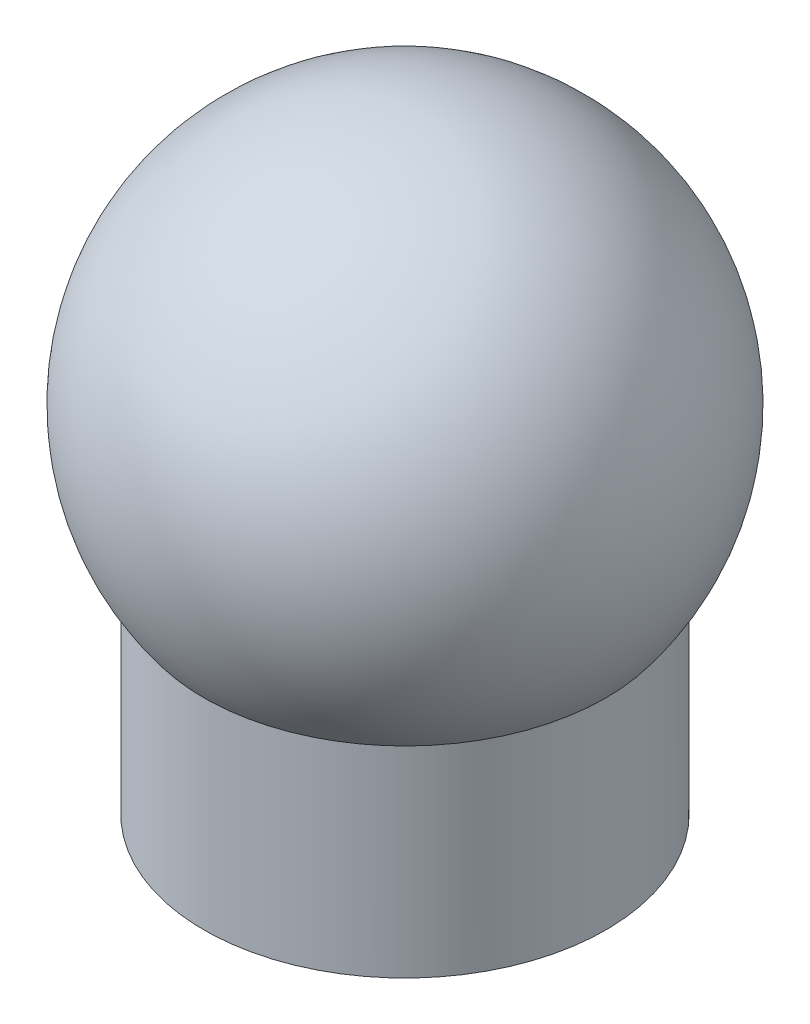
ISO-10303-21;
HEADER;
FILE_DESCRIPTION(('STEP AP214'),'2;1');
FILE_NAME('part.step','',(''),(''),'','','');
FILE_SCHEMA(('AUTOMOTIVE_DESIGN { 1 0 10303 214 1 1 1 1 }'));
ENDSEC;
DATA;
#1=APPLICATION_CONTEXT('core data for automotive mechanical design processes');
#2=APPLICATION_PROTOCOL_DEFINITION('international standard','automotive_design',2000,#1);
#3=PRODUCT_CONTEXT('',#1,'mechanical');
#4=PRODUCT('Part','Part','',(#3));
#5=PRODUCT_RELATED_PRODUCT_CATEGORY('part','',(#4));
#6=PRODUCT_DEFINITION_FORMATION('','',#4);
#7=PRODUCT_DEFINITION_CONTEXT('part definition',#1,'design');
#8=PRODUCT_DEFINITION('design','',#6,#7);
#9=PRODUCT_DEFINITION_SHAPE('','',#8);
#10=(LENGTH_UNIT() NAMED_UNIT(*) SI_UNIT(.MILLI.,.METRE.));
#11=(NAMED_UNIT(*) PLANE_ANGLE_UNIT() SI_UNIT($,.RADIAN.));
#12=(NAMED_UNIT(*) SI_UNIT($,.STERADIAN.) SOLID_ANGLE_UNIT());
#13=UNCERTAINTY_MEASURE_WITH_UNIT(LENGTH_MEASURE(1.E-05),#10,'distance_accuracy_value','');
#14=(GEOMETRIC_REPRESENTATION_CONTEXT(3) GLOBAL_UNCERTAINTY_ASSIGNED_CONTEXT((#13)) GLOBAL_UNIT_ASSIGNED_CONTEXT((#10,
#11,#12)) REPRESENTATION_CONTEXT('',''));
#15=CARTESIAN_POINT('',(0.,0.,0.));
#16=DIRECTION('',(0.,0.,1.));
#17=DIRECTION('',(1.,0.,0.));
#18=AXIS2_PLACEMENT_3D('',#15,#16,#17);
#19=CARTESIAN_POINT('',(0.,0.,0.));
#20=DIRECTION('',(0.,-1.,0.));
#21=DIRECTION('',(0.,0.,-1.));
#22=AXIS2_PLACEMENT_3D('',#19,#20,#21);
#23=PLANE('',#22);
#24=CARTESIAN_POINT('',(0.,0.,0.));
#25=DIRECTION('',(0.,-1.,0.));
#26=DIRECTION('',(0.,0.,-1.));
#27=AXIS2_PLACEMENT_3D('',#24,#25,#26);
#28=CIRCLE('',#27,5.);
#29=CARTESIAN_POINT('',(0.,0.,-5.));
#30=VERTEX_POINT('',#29);
#31=EDGE_CURVE('E10',#30,#30,#28,.T.);
#32=ORIENTED_EDGE('',*,*,#31,.T.);
#33=EDGE_LOOP('',(#32));
#34=FACE_BOUND('',#33,.T.);
#35=ADVANCED_FACE('F32',(#34),#23,.T.);
#36=CARTESIAN_POINT('',(0.,0.,0.));
#37=DIRECTION('',(0.,-1.,0.));
#38=DIRECTION('',(0.,0.,-1.));
#39=AXIS2_PLACEMENT_3D('',#36,#37,#38);
#40=CYLINDRICAL_SURFACE('',#39,5.);
#41=CARTESIAN_POINT('',(0.,5.,0.));
#42=DIRECTION('',(0.,-1.,0.));
#43=DIRECTION('',(0.,0.,-1.));
#44=AXIS2_PLACEMENT_3D('',#41,#42,#43);
#45=CIRCLE('',#44,5.);
#46=CARTESIAN_POINT('',(0.,5.,-5.));
#47=VERTEX_POINT('',#46);
#48=EDGE_CURVE('E38',#47,#47,#45,.T.);
#49=ORIENTED_EDGE('',*,*,#48,.T.);
#50=EDGE_LOOP('',(#49));
#51=FACE_BOUND('',#50,.T.);
#52=ORIENTED_EDGE('',*,*,#31,.F.);
#53=EDGE_LOOP('',(#52));
#54=FACE_BOUND('',#53,.T.);
#55=ADVANCED_FACE('F44',(#51,#54),#40,.T.);
#56=CARTESIAN_POINT('',(0.,8.83275357934736,0.));
#57=DIRECTION('',(0.,-1.,0.));
#58=DIRECTION('',(1.,0.,0.));
#59=AXIS2_PLACEMENT_3D('',#56,#57,#58);
#60=SPHERICAL_SURFACE('',#59,6.3);
#61=ORIENTED_EDGE('',*,*,#48,.F.);
#62=EDGE_LOOP('',(#61));
#63=FACE_BOUND('',#62,.T.);
#64=ADVANCED_FACE('F47',(#63),#60,.T.);
#65=CLOSED_SHELL('',(#35,#55,#64));
#66=MANIFOLD_SOLID_BREP('B2',#65);
#67=ADVANCED_BREP_SHAPE_REPRESENTATION('',(#18,#66),#14);
#68=SHAPE_DEFINITION_REPRESENTATION(#9,#67);
ENDSEC;
END-ISO-10303-21;
